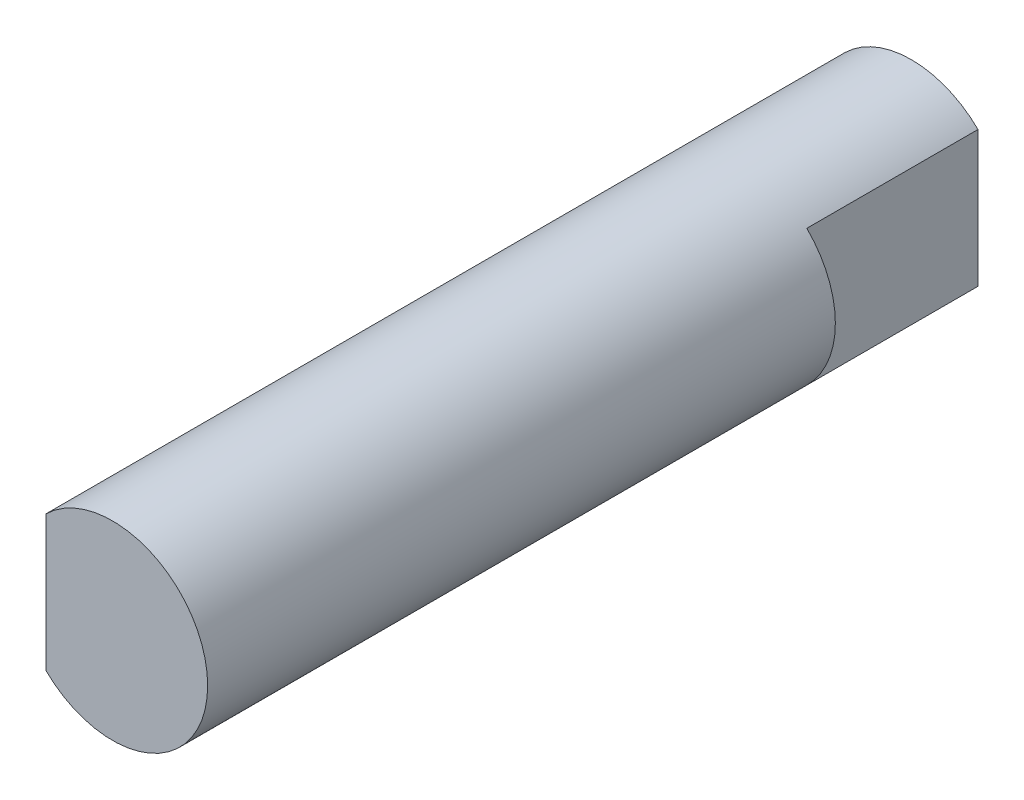
ISO-10303-21;
HEADER;
FILE_DESCRIPTION(('STEP AP214'),'2;1');
FILE_NAME('part.step','',(''),(''),'','','');
FILE_SCHEMA(('AUTOMOTIVE_DESIGN { 1 0 10303 214 1 1 1 1 }'));
ENDSEC;
DATA;
#1=APPLICATION_CONTEXT('core data for automotive mechanical design processes');
#2=APPLICATION_PROTOCOL_DEFINITION('international standard','automotive_design',2000,#1);
#3=PRODUCT_CONTEXT('',#1,'mechanical');
#4=PRODUCT('Part','Part','',(#3));
#5=PRODUCT_RELATED_PRODUCT_CATEGORY('part','',(#4));
#6=PRODUCT_DEFINITION_FORMATION('','',#4);
#7=PRODUCT_DEFINITION_CONTEXT('part definition',#1,'design');
#8=PRODUCT_DEFINITION('design','',#6,#7);
#9=PRODUCT_DEFINITION_SHAPE('','',#8);
#10=(LENGTH_UNIT() NAMED_UNIT(*) SI_UNIT(.MILLI.,.METRE.));
#11=(NAMED_UNIT(*) PLANE_ANGLE_UNIT() SI_UNIT($,.RADIAN.));
#12=(NAMED_UNIT(*) SI_UNIT($,.STERADIAN.) SOLID_ANGLE_UNIT());
#13=UNCERTAINTY_MEASURE_WITH_UNIT(LENGTH_MEASURE(1.E-05),#10,'distance_accuracy_value','');
#14=(GEOMETRIC_REPRESENTATION_CONTEXT(3) GLOBAL_UNCERTAINTY_ASSIGNED_CONTEXT((#13)) GLOBAL_UNIT_ASSIGNED_CONTEXT((#10,
#11,#12)) REPRESENTATION_CONTEXT('',''));
#15=CARTESIAN_POINT('',(0.,0.,0.));
#16=DIRECTION('',(0.,0.,1.));
#17=DIRECTION('',(1.,0.,0.));
#18=AXIS2_PLACEMENT_3D('',#15,#16,#17);
#19=CARTESIAN_POINT('',(0.,0.,21.));
#20=DIRECTION('',(0.,0.,-1.));
#21=DIRECTION('',(-1.,0.,0.));
#22=AXIS2_PLACEMENT_3D('',#19,#20,#21);
#23=CYLINDRICAL_SURFACE('',#22,2.5);
#24=CARTESIAN_POINT('',(0.,0.,21.));
#25=DIRECTION('',(0.,0.,1.));
#26=DIRECTION('',(1.,0.,0.));
#27=AXIS2_PLACEMENT_3D('',#24,#25,#26);
#28=CIRCLE('',#27,2.5);
#29=CARTESIAN_POINT('',(-1.75,-1.78535710713571,21.));
#30=VERTEX_POINT('',#29);
#31=CARTESIAN_POINT('',(-1.75,1.78535710713571,21.));
#32=VERTEX_POINT('',#31);
#33=EDGE_CURVE('E13',#30,#32,#28,.T.);
#34=ORIENTED_EDGE('',*,*,#33,.F.);
#35=DIRECTION('',(0.,0.,1.));
#36=VECTOR('',#35,1.);
#37=CARTESIAN_POINT('',(-1.75,-1.78535710713571,16.5));
#38=LINE('',#37,#36);
#39=CARTESIAN_POINT('',(-1.75,-1.78535710713571,16.5));
#40=VERTEX_POINT('',#39);
#41=EDGE_CURVE('E66',#40,#30,#38,.T.);
#42=ORIENTED_EDGE('',*,*,#41,.F.);
#43=CARTESIAN_POINT('',(0.,0.,16.5));
#44=DIRECTION('',(0.,0.,1.));
#45=DIRECTION('',(1.,0.,0.));
#46=AXIS2_PLACEMENT_3D('',#43,#44,#45);
#47=CIRCLE('',#46,2.5);
#48=CARTESIAN_POINT('',(-1.75,1.78535710713571,16.5));
#49=VERTEX_POINT('',#48);
#50=EDGE_CURVE('E106',#49,#40,#47,.T.);
#51=ORIENTED_EDGE('',*,*,#50,.F.);
#52=DIRECTION('',(0.,0.,1.));
#53=VECTOR('',#52,1.);
#54=CARTESIAN_POINT('',(-1.75,1.78535710713571,16.5));
#55=LINE('',#54,#53);
#56=EDGE_CURVE('E114',#49,#32,#55,.T.);
#57=ORIENTED_EDGE('',*,*,#56,.T.);
#58=EDGE_LOOP('',(#34,#42,#51,#57));
#59=FACE_BOUND('',#58,.T.);
#60=CARTESIAN_POINT('',(0.,0.,4.5));
#61=DIRECTION('',(0.,0.,-1.));
#62=DIRECTION('',(1.,0.,0.));
#63=AXIS2_PLACEMENT_3D('',#60,#61,#62);
#64=CIRCLE('',#63,2.5);
#65=CARTESIAN_POINT('',(-1.75,-1.78535710713571,4.5));
#66=VERTEX_POINT('',#65);
#67=CARTESIAN_POINT('',(-1.75,1.78535710713571,4.5));
#68=VERTEX_POINT('',#67);
#69=EDGE_CURVE('E129',#66,#68,#64,.T.);
#70=ORIENTED_EDGE('',*,*,#69,.F.);
#71=DIRECTION('',(0.,0.,-1.));
#72=VECTOR('',#71,1.);
#73=CARTESIAN_POINT('',(-1.75,-1.78535710713571,4.5));
#74=LINE('',#73,#72);
#75=CARTESIAN_POINT('',(-1.75,-1.78535710713571,0.));
#76=VERTEX_POINT('',#75);
#77=EDGE_CURVE('E138',#66,#76,#74,.T.);
#78=ORIENTED_EDGE('',*,*,#77,.T.);
#79=CARTESIAN_POINT('',(0.,0.,0.));
#80=DIRECTION('',(0.,0.,1.));
#81=DIRECTION('',(1.,0.,0.));
#82=AXIS2_PLACEMENT_3D('',#79,#80,#81);
#83=CIRCLE('',#82,2.5);
#84=CARTESIAN_POINT('',(1.75,-1.78535710713571,0.));
#85=VERTEX_POINT('',#84);
#86=EDGE_CURVE('E141',#76,#85,#83,.T.);
#87=ORIENTED_EDGE('',*,*,#86,.T.);
#88=DIRECTION('',(0.,0.,-1.));
#89=VECTOR('',#88,1.);
#90=CARTESIAN_POINT('',(1.75,-1.78535710713571,4.5));
#91=LINE('',#90,#89);
#92=CARTESIAN_POINT('',(1.75,-1.78535710713571,4.5));
#93=VERTEX_POINT('',#92);
#94=EDGE_CURVE('E74',#93,#85,#91,.T.);
#95=ORIENTED_EDGE('',*,*,#94,.F.);
#96=CARTESIAN_POINT('',(0.,0.,4.5));
#97=DIRECTION('',(0.,0.,-1.));
#98=DIRECTION('',(-1.,0.,0.));
#99=AXIS2_PLACEMENT_3D('',#96,#97,#98);
#100=CIRCLE('',#99,2.5);
#101=CARTESIAN_POINT('',(1.75,1.78535710713571,4.5));
#102=VERTEX_POINT('',#101);
#103=EDGE_CURVE('E143',#102,#93,#100,.T.);
#104=ORIENTED_EDGE('',*,*,#103,.F.);
#105=DIRECTION('',(0.,0.,-1.));
#106=VECTOR('',#105,1.);
#107=CARTESIAN_POINT('',(1.75,1.78535710713571,4.5));
#108=LINE('',#107,#106);
#109=CARTESIAN_POINT('',(1.75,1.78535710713571,0.));
#110=VERTEX_POINT('',#109);
#111=EDGE_CURVE('E137',#102,#110,#108,.T.);
#112=ORIENTED_EDGE('',*,*,#111,.T.);
#113=CARTESIAN_POINT('',(-1.75,1.78535710713571,0.));
#114=VERTEX_POINT('',#113);
#115=EDGE_CURVE('E55',#110,#114,#83,.T.);
#116=ORIENTED_EDGE('',*,*,#115,.T.);
#117=DIRECTION('',(0.,0.,-1.));
#118=VECTOR('',#117,1.);
#119=CARTESIAN_POINT('',(-1.75,1.78535710713571,4.5));
#120=LINE('',#119,#118);
#121=EDGE_CURVE('E135',#68,#114,#120,.T.);
#122=ORIENTED_EDGE('',*,*,#121,.F.);
#123=EDGE_LOOP('',(#70,#78,#87,#95,#104,#112,#116,#122));
#124=FACE_BOUND('',#123,.T.);
#125=ADVANCED_FACE('F52',(#59,#124),#23,.T.);
#126=CARTESIAN_POINT('',(0.,0.,21.));
#127=DIRECTION('',(0.,0.,1.));
#128=DIRECTION('',(1.,0.,0.));
#129=AXIS2_PLACEMENT_3D('',#126,#127,#128);
#130=PLANE('',#129);
#131=DIRECTION('',(0.,1.,0.));
#132=VECTOR('',#131,1.);
#133=CARTESIAN_POINT('',(-1.75,-1.78535710713571,21.));
#134=LINE('',#133,#132);
#135=EDGE_CURVE('E111',#30,#32,#134,.T.);
#136=ORIENTED_EDGE('',*,*,#135,.F.);
#137=ORIENTED_EDGE('',*,*,#33,.T.);
#138=EDGE_LOOP('',(#136,#137));
#139=FACE_BOUND('',#138,.T.);
#140=ADVANCED_FACE('F179',(#139),#130,.T.);
#141=CARTESIAN_POINT('',(0.,0.,0.));
#142=DIRECTION('',(0.,0.,1.));
#143=DIRECTION('',(1.,0.,0.));
#144=AXIS2_PLACEMENT_3D('',#141,#142,#143);
#145=PLANE('',#144);
#146=CARTESIAN_POINT('',(0.,0.,0.));
#147=DIRECTION('',(0.,0.,-1.));
#148=DIRECTION('',(-1.,0.,0.));
#149=AXIS2_PLACEMENT_3D('',#146,#147,#148);
#150=CIRCLE('',#149,1.);
#151=CARTESIAN_POINT('',(-1.,0.,0.));
#152=VERTEX_POINT('',#151);
#153=EDGE_CURVE('E119',#152,#152,#150,.T.);
#154=ORIENTED_EDGE('',*,*,#153,.F.);
#155=EDGE_LOOP('',(#154));
#156=FACE_BOUND('',#155,.T.);
#157=ORIENTED_EDGE('',*,*,#86,.F.);
#158=DIRECTION('',(0.,-1.,0.));
#159=VECTOR('',#158,1.);
#160=CARTESIAN_POINT('',(-1.75,-1.78535710713571,0.));
#161=LINE('',#160,#159);
#162=EDGE_CURVE('E132',#114,#76,#161,.T.);
#163=ORIENTED_EDGE('',*,*,#162,.F.);
#164=ORIENTED_EDGE('',*,*,#115,.F.);
#165=DIRECTION('',(0.,1.,0.));
#166=VECTOR('',#165,1.);
#167=CARTESIAN_POINT('',(1.75,-1.78535710713571,0.));
#168=LINE('',#167,#166);
#169=EDGE_CURVE('E126',#85,#110,#168,.T.);
#170=ORIENTED_EDGE('',*,*,#169,.F.);
#171=EDGE_LOOP('',(#157,#163,#164,#170));
#172=FACE_BOUND('',#171,.T.);
#173=ADVANCED_FACE('F159',(#156,#172),#145,.F.);
#174=CARTESIAN_POINT('',(1.75,-1.78535710713571,4.5));
#175=DIRECTION('',(-1.,0.,0.));
#176=DIRECTION('',(0.,0.,1.));
#177=AXIS2_PLACEMENT_3D('',#174,#175,#176);
#178=PLANE('',#177);
#179=ORIENTED_EDGE('',*,*,#169,.T.);
#180=ORIENTED_EDGE('',*,*,#111,.F.);
#181=DIRECTION('',(0.,1.,0.));
#182=VECTOR('',#181,1.);
#183=CARTESIAN_POINT('',(1.75,-1.78535710713571,4.5));
#184=LINE('',#183,#182);
#185=EDGE_CURVE('E145',#93,#102,#184,.T.);
#186=ORIENTED_EDGE('',*,*,#185,.F.);
#187=ORIENTED_EDGE('',*,*,#94,.T.);
#188=EDGE_LOOP('',(#179,#180,#186,#187));
#189=FACE_BOUND('',#188,.T.);
#190=ADVANCED_FACE('F188',(#189),#178,.F.);
#191=CARTESIAN_POINT('',(0.,0.,4.5));
#192=DIRECTION('',(0.,0.,-1.));
#193=DIRECTION('',(-1.,0.,0.));
#194=AXIS2_PLACEMENT_3D('',#191,#192,#193);
#195=PLANE('',#194);
#196=ORIENTED_EDGE('',*,*,#103,.T.);
#197=ORIENTED_EDGE('',*,*,#185,.T.);
#198=EDGE_LOOP('',(#196,#197));
#199=FACE_BOUND('',#198,.T.);
#200=ADVANCED_FACE('F176',(#199),#195,.T.);
#201=CARTESIAN_POINT('',(-1.75,-1.78535710713571,4.5));
#202=DIRECTION('',(1.,0.,0.));
#203=DIRECTION('',(0.,0.,-1.));
#204=AXIS2_PLACEMENT_3D('',#201,#202,#203);
#205=PLANE('',#204);
#206=ORIENTED_EDGE('',*,*,#162,.T.);
#207=ORIENTED_EDGE('',*,*,#77,.F.);
#208=DIRECTION('',(0.,-1.,0.));
#209=VECTOR('',#208,1.);
#210=CARTESIAN_POINT('',(-1.75,-1.78535710713571,4.5));
#211=LINE('',#210,#209);
#212=EDGE_CURVE('E131',#68,#66,#211,.T.);
#213=ORIENTED_EDGE('',*,*,#212,.F.);
#214=ORIENTED_EDGE('',*,*,#121,.T.);
#215=EDGE_LOOP('',(#206,#207,#213,#214));
#216=FACE_BOUND('',#215,.T.);
#217=ADVANCED_FACE('F163',(#216),#205,.F.);
#218=CARTESIAN_POINT('',(0.,0.,4.5));
#219=DIRECTION('',(0.,0.,1.));
#220=DIRECTION('',(1.,0.,0.));
#221=AXIS2_PLACEMENT_3D('',#218,#219,#220);
#222=PLANE('',#221);
#223=ORIENTED_EDGE('',*,*,#69,.T.);
#224=ORIENTED_EDGE('',*,*,#212,.T.);
#225=EDGE_LOOP('',(#223,#224));
#226=FACE_BOUND('',#225,.T.);
#227=ADVANCED_FACE('F165',(#226),#222,.F.);
#228=CARTESIAN_POINT('',(0.,0.,6.));
#229=DIRECTION('',(0.,0.,-1.));
#230=DIRECTION('',(-1.,0.,0.));
#231=AXIS2_PLACEMENT_3D('',#228,#229,#230);
#232=CYLINDRICAL_SURFACE('',#231,1.);
#233=CARTESIAN_POINT('',(0.,0.,6.));
#234=DIRECTION('',(0.,0.,-1.));
#235=DIRECTION('',(-1.,0.,0.));
#236=AXIS2_PLACEMENT_3D('',#233,#234,#235);
#237=CIRCLE('',#236,1.);
#238=CARTESIAN_POINT('',(-1.,0.,6.));
#239=VERTEX_POINT('',#238);
#240=EDGE_CURVE('E123',#239,#239,#237,.T.);
#241=ORIENTED_EDGE('',*,*,#240,.F.);
#242=EDGE_LOOP('',(#241));
#243=FACE_BOUND('',#242,.T.);
#244=ORIENTED_EDGE('',*,*,#153,.T.);
#245=EDGE_LOOP('',(#244));
#246=FACE_BOUND('',#245,.T.);
#247=ADVANCED_FACE('F167',(#243,#246),#232,.F.);
#248=CARTESIAN_POINT('',(0.,0.,6.));
#249=DIRECTION('',(0.,0.,-1.));
#250=DIRECTION('',(-1.,0.,0.));
#251=AXIS2_PLACEMENT_3D('',#248,#249,#250);
#252=PLANE('',#251);
#253=ORIENTED_EDGE('',*,*,#240,.T.);
#254=EDGE_LOOP('',(#253));
#255=FACE_BOUND('',#254,.T.);
#256=ADVANCED_FACE('F173',(#255),#252,.T.);
#257=CARTESIAN_POINT('',(-1.75,-1.78535710713571,16.5));
#258=DIRECTION('',(1.,0.,0.));
#259=DIRECTION('',(0.,0.,-1.));
#260=AXIS2_PLACEMENT_3D('',#257,#258,#259);
#261=PLANE('',#260);
#262=ORIENTED_EDGE('',*,*,#135,.T.);
#263=ORIENTED_EDGE('',*,*,#56,.F.);
#264=DIRECTION('',(0.,1.,0.));
#265=VECTOR('',#264,1.);
#266=CARTESIAN_POINT('',(-1.75,-1.78535710713571,16.5));
#267=LINE('',#266,#265);
#268=EDGE_CURVE('E108',#40,#49,#267,.T.);
#269=ORIENTED_EDGE('',*,*,#268,.F.);
#270=ORIENTED_EDGE('',*,*,#41,.T.);
#271=EDGE_LOOP('',(#262,#263,#269,#270));
#272=FACE_BOUND('',#271,.T.);
#273=ADVANCED_FACE('F113',(#272),#261,.F.);
#274=CARTESIAN_POINT('',(0.,0.,16.5));
#275=DIRECTION('',(0.,0.,1.));
#276=DIRECTION('',(1.,0.,0.));
#277=AXIS2_PLACEMENT_3D('',#274,#275,#276);
#278=PLANE('',#277);
#279=ORIENTED_EDGE('',*,*,#50,.T.);
#280=ORIENTED_EDGE('',*,*,#268,.T.);
#281=EDGE_LOOP('',(#279,#280));
#282=FACE_BOUND('',#281,.T.);
#283=ADVANCED_FACE('F107',(#282),#278,.T.);
#284=CLOSED_SHELL('',(#125,#140,#173,#190,#200,#217,#227,#247,#256,#273,#283));
#285=MANIFOLD_SOLID_BREP('B2',#284);
#286=ADVANCED_BREP_SHAPE_REPRESENTATION('',(#18,#285),#14);
#287=SHAPE_DEFINITION_REPRESENTATION(#9,#286);
ENDSEC;
END-ISO-10303-21;
